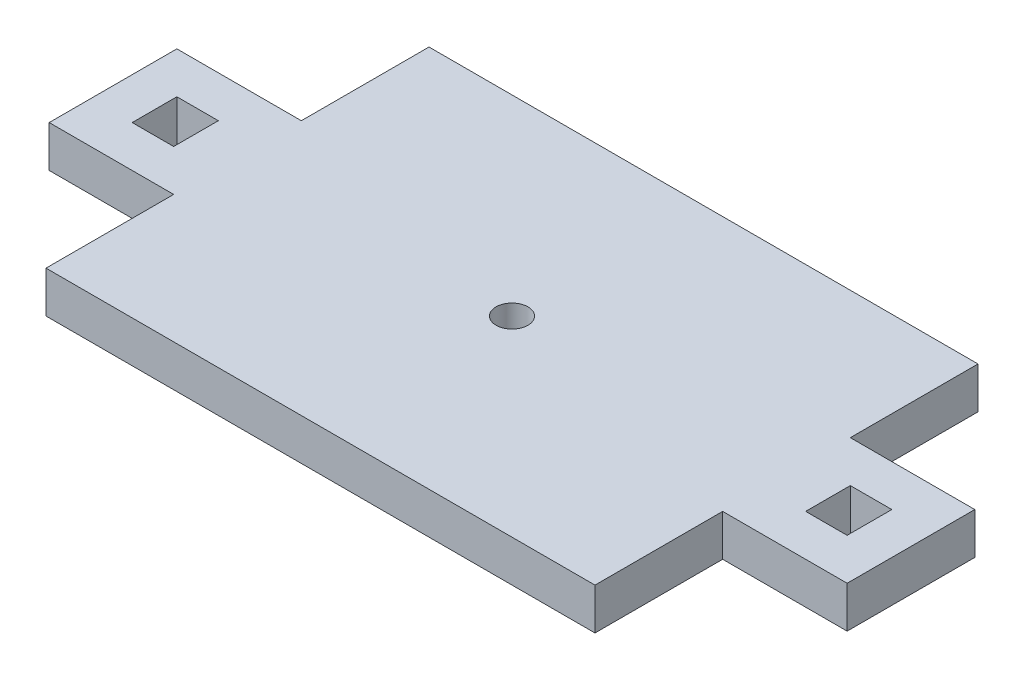
ISO-10303-21;
HEADER;
FILE_DESCRIPTION(('STEP AP214'),'2;1');
FILE_NAME('part.step','',(''),(''),'','','');
FILE_SCHEMA(('AUTOMOTIVE_DESIGN { 1 0 10303 214 1 1 1 1 }'));
ENDSEC;
DATA;
#1=APPLICATION_CONTEXT('core data for automotive mechanical design processes');
#2=APPLICATION_PROTOCOL_DEFINITION('international standard','automotive_design',2000,#1);
#3=PRODUCT_CONTEXT('',#1,'mechanical');
#4=PRODUCT('Part','Part','',(#3));
#5=PRODUCT_RELATED_PRODUCT_CATEGORY('part','',(#4));
#6=PRODUCT_DEFINITION_FORMATION('','',#4);
#7=PRODUCT_DEFINITION_CONTEXT('part definition',#1,'design');
#8=PRODUCT_DEFINITION('design','',#6,#7);
#9=PRODUCT_DEFINITION_SHAPE('','',#8);
#10=(LENGTH_UNIT() NAMED_UNIT(*) SI_UNIT(.MILLI.,.METRE.));
#11=(NAMED_UNIT(*) PLANE_ANGLE_UNIT() SI_UNIT($,.RADIAN.));
#12=(NAMED_UNIT(*) SI_UNIT($,.STERADIAN.) SOLID_ANGLE_UNIT());
#13=UNCERTAINTY_MEASURE_WITH_UNIT(LENGTH_MEASURE(1.E-05),#10,'distance_accuracy_value','');
#14=(GEOMETRIC_REPRESENTATION_CONTEXT(3) GLOBAL_UNCERTAINTY_ASSIGNED_CONTEXT((#13)) GLOBAL_UNIT_ASSIGNED_CONTEXT((#10,
#11,#12)) REPRESENTATION_CONTEXT('',''));
#15=CARTESIAN_POINT('',(0.,0.,0.));
#16=DIRECTION('',(0.,0.,1.));
#17=DIRECTION('',(1.,0.,0.));
#18=AXIS2_PLACEMENT_3D('',#15,#16,#17);
#19=CARTESIAN_POINT('',(0.,6.5,0.));
#20=DIRECTION('',(1.,0.,0.));
#21=DIRECTION('',(0.,0.,-1.));
#22=AXIS2_PLACEMENT_3D('',#19,#20,#21);
#23=PLANE('',#22);
#24=DIRECTION('',(0.,0.,1.));
#25=VECTOR('',#24,1.);
#26=CARTESIAN_POINT('',(0.,0.,0.));
#27=LINE('',#26,#25);
#28=CARTESIAN_POINT('',(0.,0.,-40.));
#29=VERTEX_POINT('',#28);
#30=CARTESIAN_POINT('',(0.,0.,-20.));
#31=VERTEX_POINT('',#30);
#32=EDGE_CURVE('E316',#29,#31,#27,.T.);
#33=ORIENTED_EDGE('',*,*,#32,.T.);
#34=DIRECTION('',(0.,1.,0.));
#35=VECTOR('',#34,1.);
#36=CARTESIAN_POINT('',(0.,-0.00100000000000013,-20.));
#37=LINE('',#36,#35);
#38=CARTESIAN_POINT('',(0.,6.5,-20.));
#39=VERTEX_POINT('',#38);
#40=EDGE_CURVE('E291',#31,#39,#37,.T.);
#41=ORIENTED_EDGE('',*,*,#40,.T.);
#42=DIRECTION('',(0.,0.,1.));
#43=VECTOR('',#42,1.);
#44=CARTESIAN_POINT('',(0.,6.5,0.));
#45=LINE('',#44,#43);
#46=CARTESIAN_POINT('',(0.,6.5,-40.));
#47=VERTEX_POINT('',#46);
#48=EDGE_CURVE('E317',#47,#39,#45,.T.);
#49=ORIENTED_EDGE('',*,*,#48,.F.);
#50=DIRECTION('',(0.,1.,0.));
#51=VECTOR('',#50,1.);
#52=CARTESIAN_POINT('',(0.,-0.00100000000000013,-40.));
#53=LINE('',#52,#51);
#54=EDGE_CURVE('E306',#29,#47,#53,.T.);
#55=ORIENTED_EDGE('',*,*,#54,.F.);
#56=EDGE_LOOP('',(#33,#41,#49,#55));
#57=FACE_BOUND('',#56,.T.);
#58=ADVANCED_FACE('F33',(#57),#23,.F.);
#59=CARTESIAN_POINT('',(0.,6.5,0.));
#60=DIRECTION('',(0.,0.,-1.));
#61=DIRECTION('',(-1.,0.,0.));
#62=AXIS2_PLACEMENT_3D('',#59,#60,#61);
#63=PLANE('',#62);
#64=DIRECTION('',(1.,0.,0.));
#65=VECTOR('',#64,1.);
#66=CARTESIAN_POINT('',(0.,0.,0.));
#67=LINE('',#66,#65);
#68=CARTESIAN_POINT('',(19.5,0.,0.));
#69=VERTEX_POINT('',#68);
#70=CARTESIAN_POINT('',(105.5,0.,0.));
#71=VERTEX_POINT('',#70);
#72=EDGE_CURVE('E326',#69,#71,#67,.T.);
#73=ORIENTED_EDGE('',*,*,#72,.T.);
#74=DIRECTION('',(0.,1.,0.));
#75=VECTOR('',#74,1.);
#76=CARTESIAN_POINT('',(105.5,-0.00100000000000013,0.));
#77=LINE('',#76,#75);
#78=CARTESIAN_POINT('',(105.5,6.5,0.));
#79=VERTEX_POINT('',#78);
#80=EDGE_CURVE('E251',#71,#79,#77,.T.);
#81=ORIENTED_EDGE('',*,*,#80,.T.);
#82=DIRECTION('',(1.,0.,0.));
#83=VECTOR('',#82,1.);
#84=CARTESIAN_POINT('',(0.,6.5,0.));
#85=LINE('',#84,#83);
#86=CARTESIAN_POINT('',(19.5,6.5,0.));
#87=VERTEX_POINT('',#86);
#88=EDGE_CURVE('E320',#87,#79,#85,.T.);
#89=ORIENTED_EDGE('',*,*,#88,.F.);
#90=DIRECTION('',(0.,1.,0.));
#91=VECTOR('',#90,1.);
#92=CARTESIAN_POINT('',(19.5,-0.00100000000000013,0.));
#93=LINE('',#92,#91);
#94=EDGE_CURVE('E290',#69,#87,#93,.T.);
#95=ORIENTED_EDGE('',*,*,#94,.F.);
#96=EDGE_LOOP('',(#73,#81,#89,#95));
#97=FACE_BOUND('',#96,.T.);
#98=ADVANCED_FACE('F373',(#97),#63,.F.);
#99=CARTESIAN_POINT('',(125.,6.5,0.));
#100=DIRECTION('',(-1.,0.,0.));
#101=DIRECTION('',(0.,0.,1.));
#102=AXIS2_PLACEMENT_3D('',#99,#100,#101);
#103=PLANE('',#102);
#104=DIRECTION('',(0.,0.,-1.));
#105=VECTOR('',#104,1.);
#106=CARTESIAN_POINT('',(125.,6.5,0.));
#107=LINE('',#106,#105);
#108=CARTESIAN_POINT('',(125.,6.5,-20.));
#109=VERTEX_POINT('',#108);
#110=CARTESIAN_POINT('',(125.,6.5,-40.));
#111=VERTEX_POINT('',#110);
#112=EDGE_CURVE('E41',#109,#111,#107,.T.);
#113=ORIENTED_EDGE('',*,*,#112,.F.);
#114=DIRECTION('',(0.,1.,0.));
#115=VECTOR('',#114,1.);
#116=CARTESIAN_POINT('',(125.,-0.00100000000000013,-20.));
#117=LINE('',#116,#115);
#118=CARTESIAN_POINT('',(125.,0.,-20.));
#119=VERTEX_POINT('',#118);
#120=EDGE_CURVE('E250',#119,#109,#117,.T.);
#121=ORIENTED_EDGE('',*,*,#120,.F.);
#122=DIRECTION('',(0.,0.,-1.));
#123=VECTOR('',#122,1.);
#124=CARTESIAN_POINT('',(125.,0.,0.));
#125=LINE('',#124,#123);
#126=CARTESIAN_POINT('',(125.,0.,-40.));
#127=VERTEX_POINT('',#126);
#128=EDGE_CURVE('E328',#119,#127,#125,.T.);
#129=ORIENTED_EDGE('',*,*,#128,.T.);
#130=DIRECTION('',(0.,1.,0.));
#131=VECTOR('',#130,1.);
#132=CARTESIAN_POINT('',(125.,-0.00100000000000013,-40.));
#133=LINE('',#132,#131);
#134=EDGE_CURVE('E273',#127,#111,#133,.T.);
#135=ORIENTED_EDGE('',*,*,#134,.T.);
#136=EDGE_LOOP('',(#113,#121,#129,#135));
#137=FACE_BOUND('',#136,.T.);
#138=ADVANCED_FACE('F363',(#137),#103,.F.);
#139=CARTESIAN_POINT('',(0.,6.5,-60.));
#140=DIRECTION('',(0.,0.,1.));
#141=DIRECTION('',(1.,0.,0.));
#142=AXIS2_PLACEMENT_3D('',#139,#140,#141);
#143=PLANE('',#142);
#144=DIRECTION('',(-1.,0.,0.));
#145=VECTOR('',#144,1.);
#146=CARTESIAN_POINT('',(0.,6.5,-60.));
#147=LINE('',#146,#145);
#148=CARTESIAN_POINT('',(105.5,6.5,-60.));
#149=VERTEX_POINT('',#148);
#150=CARTESIAN_POINT('',(19.5,6.5,-60.));
#151=VERTEX_POINT('',#150);
#152=EDGE_CURVE('E11',#149,#151,#147,.T.);
#153=ORIENTED_EDGE('',*,*,#152,.F.);
#154=DIRECTION('',(0.,1.,0.));
#155=VECTOR('',#154,1.);
#156=CARTESIAN_POINT('',(105.5,-0.00100000000000013,-60.));
#157=LINE('',#156,#155);
#158=CARTESIAN_POINT('',(105.5,0.,-60.));
#159=VERTEX_POINT('',#158);
#160=EDGE_CURVE('E272',#159,#149,#157,.T.);
#161=ORIENTED_EDGE('',*,*,#160,.F.);
#162=DIRECTION('',(-1.,0.,0.));
#163=VECTOR('',#162,1.);
#164=CARTESIAN_POINT('',(0.,0.,-60.));
#165=LINE('',#164,#163);
#166=CARTESIAN_POINT('',(19.5,0.,-60.));
#167=VERTEX_POINT('',#166);
#168=EDGE_CURVE('E36',#159,#167,#165,.T.);
#169=ORIENTED_EDGE('',*,*,#168,.T.);
#170=DIRECTION('',(0.,1.,0.));
#171=VECTOR('',#170,1.);
#172=CARTESIAN_POINT('',(19.5,-0.00100000000000013,-60.));
#173=LINE('',#172,#171);
#174=EDGE_CURVE('E307',#167,#151,#173,.T.);
#175=ORIENTED_EDGE('',*,*,#174,.T.);
#176=EDGE_LOOP('',(#153,#161,#169,#175));
#177=FACE_BOUND('',#176,.T.);
#178=ADVANCED_FACE('F338',(#177),#143,.F.);
#179=CARTESIAN_POINT('',(0.,6.5,0.));
#180=DIRECTION('',(0.,-1.,0.));
#181=DIRECTION('',(0.,0.,-1.));
#182=AXIS2_PLACEMENT_3D('',#179,#180,#181);
#183=PLANE('',#182);
#184=DIRECTION('',(-1.,0.,0.));
#185=VECTOR('',#184,1.);
#186=CARTESIAN_POINT('',(118.5,6.5,-33.5));
#187=LINE('',#186,#185);
#188=CARTESIAN_POINT('',(118.5,6.5,-33.5));
#189=VERTEX_POINT('',#188);
#190=CARTESIAN_POINT('',(112.,6.5,-33.5));
#191=VERTEX_POINT('',#190);
#192=EDGE_CURVE('E189',#189,#191,#187,.T.);
#193=ORIENTED_EDGE('',*,*,#192,.F.);
#194=DIRECTION('',(0.,0.,-1.));
#195=VECTOR('',#194,1.);
#196=CARTESIAN_POINT('',(118.5,6.5,-33.5));
#197=LINE('',#196,#195);
#198=CARTESIAN_POINT('',(118.5,6.5,-26.5));
#199=VERTEX_POINT('',#198);
#200=EDGE_CURVE('E49',#199,#189,#197,.T.);
#201=ORIENTED_EDGE('',*,*,#200,.F.);
#202=DIRECTION('',(1.,0.,0.));
#203=VECTOR('',#202,1.);
#204=CARTESIAN_POINT('',(118.5,6.5,-26.5));
#205=LINE('',#204,#203);
#206=CARTESIAN_POINT('',(112.,6.5,-26.5));
#207=VERTEX_POINT('',#206);
#208=EDGE_CURVE('E182',#207,#199,#205,.T.);
#209=ORIENTED_EDGE('',*,*,#208,.F.);
#210=DIRECTION('',(0.,0.,1.));
#211=VECTOR('',#210,1.);
#212=CARTESIAN_POINT('',(112.,6.5,-33.5));
#213=LINE('',#212,#211);
#214=EDGE_CURVE('E196',#191,#207,#213,.T.);
#215=ORIENTED_EDGE('',*,*,#214,.F.);
#216=EDGE_LOOP('',(#193,#201,#209,#215));
#217=FACE_BOUND('',#216,.T.);
#218=DIRECTION('',(1.,0.,0.));
#219=VECTOR('',#218,1.);
#220=CARTESIAN_POINT('',(6.5,6.5,-26.5));
#221=LINE('',#220,#219);
#222=CARTESIAN_POINT('',(6.5,6.5,-26.5));
#223=VERTEX_POINT('',#222);
#224=CARTESIAN_POINT('',(13.,6.5,-26.5));
#225=VERTEX_POINT('',#224);
#226=EDGE_CURVE('E215',#223,#225,#221,.T.);
#227=ORIENTED_EDGE('',*,*,#226,.F.);
#228=DIRECTION('',(0.,0.,1.));
#229=VECTOR('',#228,1.);
#230=CARTESIAN_POINT('',(6.5,6.5,-33.5));
#231=LINE('',#230,#229);
#232=CARTESIAN_POINT('',(6.5,6.5,-33.5));
#233=VERTEX_POINT('',#232);
#234=EDGE_CURVE('E213',#233,#223,#231,.T.);
#235=ORIENTED_EDGE('',*,*,#234,.F.);
#236=DIRECTION('',(-1.,0.,0.));
#237=VECTOR('',#236,1.);
#238=CARTESIAN_POINT('',(6.5,6.5,-33.5));
#239=LINE('',#238,#237);
#240=CARTESIAN_POINT('',(13.,6.5,-33.5));
#241=VERTEX_POINT('',#240);
#242=EDGE_CURVE('E221',#241,#233,#239,.T.);
#243=ORIENTED_EDGE('',*,*,#242,.F.);
#244=DIRECTION('',(0.,0.,-1.));
#245=VECTOR('',#244,1.);
#246=CARTESIAN_POINT('',(13.,6.5,-33.5));
#247=LINE('',#246,#245);
#248=EDGE_CURVE('E218',#225,#241,#247,.T.);
#249=ORIENTED_EDGE('',*,*,#248,.F.);
#250=EDGE_LOOP('',(#227,#235,#243,#249));
#251=FACE_BOUND('',#250,.T.);
#252=CARTESIAN_POINT('',(62.5,6.5,-30.));
#253=DIRECTION('',(0.,1.,0.));
#254=DIRECTION('',(0.,0.,1.));
#255=AXIS2_PLACEMENT_3D('',#252,#253,#254);
#256=CIRCLE('',#255,2.50000000000001);
#257=CARTESIAN_POINT('',(62.5,6.5,-27.5));
#258=VERTEX_POINT('',#257);
#259=EDGE_CURVE('E237',#258,#258,#256,.T.);
#260=ORIENTED_EDGE('',*,*,#259,.F.);
#261=EDGE_LOOP('',(#260));
#262=FACE_BOUND('',#261,.T.);
#263=ORIENTED_EDGE('',*,*,#88,.T.);
#264=DIRECTION('',(0.,0.,1.));
#265=VECTOR('',#264,1.);
#266=CARTESIAN_POINT('',(105.5,6.5,0.));
#267=LINE('',#266,#265);
#268=CARTESIAN_POINT('',(105.5,6.5,-20.));
#269=VERTEX_POINT('',#268);
#270=EDGE_CURVE('E248',#269,#79,#267,.T.);
#271=ORIENTED_EDGE('',*,*,#270,.F.);
#272=DIRECTION('',(-1.,0.,0.));
#273=VECTOR('',#272,1.);
#274=CARTESIAN_POINT('',(125.,6.5,-20.));
#275=LINE('',#274,#273);
#276=EDGE_CURVE('E245',#109,#269,#275,.T.);
#277=ORIENTED_EDGE('',*,*,#276,.F.);
#278=ORIENTED_EDGE('',*,*,#112,.T.);
#279=DIRECTION('',(1.,0.,0.));
#280=VECTOR('',#279,1.);
#281=CARTESIAN_POINT('',(125.,6.5,-40.));
#282=LINE('',#281,#280);
#283=CARTESIAN_POINT('',(105.5,6.5,-40.));
#284=VERTEX_POINT('',#283);
#285=EDGE_CURVE('E269',#284,#111,#282,.T.);
#286=ORIENTED_EDGE('',*,*,#285,.F.);
#287=DIRECTION('',(0.,0.,1.));
#288=VECTOR('',#287,1.);
#289=CARTESIAN_POINT('',(105.5,6.5,-60.));
#290=LINE('',#289,#288);
#291=EDGE_CURVE('E266',#149,#284,#290,.T.);
#292=ORIENTED_EDGE('',*,*,#291,.F.);
#293=ORIENTED_EDGE('',*,*,#152,.T.);
#294=DIRECTION('',(0.,0.,-1.));
#295=VECTOR('',#294,1.);
#296=CARTESIAN_POINT('',(19.5,6.5,-60.));
#297=LINE('',#296,#295);
#298=CARTESIAN_POINT('',(19.5,6.5,-40.));
#299=VERTEX_POINT('',#298);
#300=EDGE_CURVE('E303',#299,#151,#297,.T.);
#301=ORIENTED_EDGE('',*,*,#300,.F.);
#302=DIRECTION('',(1.,0.,0.));
#303=VECTOR('',#302,1.);
#304=CARTESIAN_POINT('',(0.,6.5,-40.));
#305=LINE('',#304,#303);
#306=EDGE_CURVE('E300',#47,#299,#305,.T.);
#307=ORIENTED_EDGE('',*,*,#306,.F.);
#308=ORIENTED_EDGE('',*,*,#48,.T.);
#309=DIRECTION('',(-1.,0.,0.));
#310=VECTOR('',#309,1.);
#311=CARTESIAN_POINT('',(0.,6.5,-20.));
#312=LINE('',#311,#310);
#313=CARTESIAN_POINT('',(19.5,6.5,-20.));
#314=VERTEX_POINT('',#313);
#315=EDGE_CURVE('E288',#314,#39,#312,.T.);
#316=ORIENTED_EDGE('',*,*,#315,.F.);
#317=DIRECTION('',(0.,0.,-1.));
#318=VECTOR('',#317,1.);
#319=CARTESIAN_POINT('',(19.5,6.5,0.));
#320=LINE('',#319,#318);
#321=EDGE_CURVE('E285',#87,#314,#320,.T.);
#322=ORIENTED_EDGE('',*,*,#321,.F.);
#323=EDGE_LOOP('',(#263,#271,#277,#278,#286,#292,#293,#301,#307,#308,#316,#322));
#324=FACE_BOUND('',#323,.T.);
#325=ADVANCED_FACE('F353',(#217,#251,#262,#324),#183,.F.);
#326=CARTESIAN_POINT('',(0.,0.,0.));
#327=DIRECTION('',(0.,-1.,0.));
#328=DIRECTION('',(0.,0.,-1.));
#329=AXIS2_PLACEMENT_3D('',#326,#327,#328);
#330=PLANE('',#329);
#331=DIRECTION('',(0.,0.,-1.));
#332=VECTOR('',#331,1.);
#333=CARTESIAN_POINT('',(118.5,0.,-33.5));
#334=LINE('',#333,#332);
#335=CARTESIAN_POINT('',(118.5,0.,-26.5));
#336=VERTEX_POINT('',#335);
#337=CARTESIAN_POINT('',(118.5,0.,-33.5));
#338=VERTEX_POINT('',#337);
#339=EDGE_CURVE('E180',#336,#338,#334,.T.);
#340=ORIENTED_EDGE('',*,*,#339,.T.);
#341=DIRECTION('',(-1.,0.,0.));
#342=VECTOR('',#341,1.);
#343=CARTESIAN_POINT('',(118.5,0.,-33.5));
#344=LINE('',#343,#342);
#345=CARTESIAN_POINT('',(112.,0.,-33.5));
#346=VERTEX_POINT('',#345);
#347=EDGE_CURVE('E169',#338,#346,#344,.T.);
#348=ORIENTED_EDGE('',*,*,#347,.T.);
#349=DIRECTION('',(0.,0.,1.));
#350=VECTOR('',#349,1.);
#351=CARTESIAN_POINT('',(112.,0.,-33.5));
#352=LINE('',#351,#350);
#353=CARTESIAN_POINT('',(112.,0.,-26.5));
#354=VERTEX_POINT('',#353);
#355=EDGE_CURVE('E191',#346,#354,#352,.T.);
#356=ORIENTED_EDGE('',*,*,#355,.T.);
#357=DIRECTION('',(1.,0.,0.));
#358=VECTOR('',#357,1.);
#359=CARTESIAN_POINT('',(118.5,0.,-26.5));
#360=LINE('',#359,#358);
#361=EDGE_CURVE('E187',#354,#336,#360,.T.);
#362=ORIENTED_EDGE('',*,*,#361,.T.);
#363=EDGE_LOOP('',(#340,#348,#356,#362));
#364=FACE_BOUND('',#363,.T.);
#365=DIRECTION('',(0.,0.,1.));
#366=VECTOR('',#365,1.);
#367=CARTESIAN_POINT('',(6.5,0.,-33.5));
#368=LINE('',#367,#366);
#369=CARTESIAN_POINT('',(6.5,0.,-33.5));
#370=VERTEX_POINT('',#369);
#371=CARTESIAN_POINT('',(6.5,0.,-26.5));
#372=VERTEX_POINT('',#371);
#373=EDGE_CURVE('E210',#370,#372,#368,.T.);
#374=ORIENTED_EDGE('',*,*,#373,.T.);
#375=DIRECTION('',(1.,0.,0.));
#376=VECTOR('',#375,1.);
#377=CARTESIAN_POINT('',(6.5,0.,-26.5));
#378=LINE('',#377,#376);
#379=CARTESIAN_POINT('',(13.,0.,-26.5));
#380=VERTEX_POINT('',#379);
#381=EDGE_CURVE('E227',#372,#380,#378,.T.);
#382=ORIENTED_EDGE('',*,*,#381,.T.);
#383=DIRECTION('',(0.,0.,-1.));
#384=VECTOR('',#383,1.);
#385=CARTESIAN_POINT('',(13.,0.,-33.5));
#386=LINE('',#385,#384);
#387=CARTESIAN_POINT('',(13.,0.,-33.5));
#388=VERTEX_POINT('',#387);
#389=EDGE_CURVE('E176',#380,#388,#386,.T.);
#390=ORIENTED_EDGE('',*,*,#389,.T.);
#391=DIRECTION('',(-1.,0.,0.));
#392=VECTOR('',#391,1.);
#393=CARTESIAN_POINT('',(6.5,0.,-33.5));
#394=LINE('',#393,#392);
#395=EDGE_CURVE('E207',#388,#370,#394,.T.);
#396=ORIENTED_EDGE('',*,*,#395,.T.);
#397=EDGE_LOOP('',(#374,#382,#390,#396));
#398=FACE_BOUND('',#397,.T.);
#399=CARTESIAN_POINT('',(62.5,0.,-30.));
#400=DIRECTION('',(0.,-1.,0.));
#401=DIRECTION('',(0.,0.,-1.));
#402=AXIS2_PLACEMENT_3D('',#399,#400,#401);
#403=CIRCLE('',#402,2.50000000000001);
#404=CARTESIAN_POINT('',(62.5,0.,-27.5));
#405=VERTEX_POINT('',#404);
#406=EDGE_CURVE('E236',#405,#405,#403,.F.);
#407=ORIENTED_EDGE('',*,*,#406,.T.);
#408=EDGE_LOOP('',(#407));
#409=FACE_BOUND('',#408,.T.);
#410=DIRECTION('',(0.,0.,1.));
#411=VECTOR('',#410,1.);
#412=CARTESIAN_POINT('',(105.5,0.,0.));
#413=LINE('',#412,#411);
#414=CARTESIAN_POINT('',(105.5,0.,-20.));
#415=VERTEX_POINT('',#414);
#416=EDGE_CURVE('E240',#415,#71,#413,.T.);
#417=ORIENTED_EDGE('',*,*,#416,.T.);
#418=ORIENTED_EDGE('',*,*,#72,.F.);
#419=DIRECTION('',(0.,0.,-1.));
#420=VECTOR('',#419,1.);
#421=CARTESIAN_POINT('',(19.5,0.,0.));
#422=LINE('',#421,#420);
#423=CARTESIAN_POINT('',(19.5,0.,-20.));
#424=VERTEX_POINT('',#423);
#425=EDGE_CURVE('E276',#69,#424,#422,.T.);
#426=ORIENTED_EDGE('',*,*,#425,.T.);
#427=DIRECTION('',(-1.,0.,0.));
#428=VECTOR('',#427,1.);
#429=CARTESIAN_POINT('',(0.,0.,-20.));
#430=LINE('',#429,#428);
#431=EDGE_CURVE('E282',#424,#31,#430,.T.);
#432=ORIENTED_EDGE('',*,*,#431,.T.);
#433=ORIENTED_EDGE('',*,*,#32,.F.);
#434=DIRECTION('',(1.,0.,0.));
#435=VECTOR('',#434,1.);
#436=CARTESIAN_POINT('',(0.,0.,-40.));
#437=LINE('',#436,#435);
#438=CARTESIAN_POINT('',(19.5,0.,-40.));
#439=VERTEX_POINT('',#438);
#440=EDGE_CURVE('E310',#29,#439,#437,.T.);
#441=ORIENTED_EDGE('',*,*,#440,.T.);
#442=DIRECTION('',(0.,0.,-1.));
#443=VECTOR('',#442,1.);
#444=CARTESIAN_POINT('',(19.5,0.,-60.));
#445=LINE('',#444,#443);
#446=EDGE_CURVE('E294',#439,#167,#445,.T.);
#447=ORIENTED_EDGE('',*,*,#446,.T.);
#448=ORIENTED_EDGE('',*,*,#168,.F.);
#449=DIRECTION('',(0.,0.,1.));
#450=VECTOR('',#449,1.);
#451=CARTESIAN_POINT('',(105.5,0.,-60.));
#452=LINE('',#451,#450);
#453=CARTESIAN_POINT('',(105.5,0.,-40.));
#454=VERTEX_POINT('',#453);
#455=EDGE_CURVE('E260',#159,#454,#452,.T.);
#456=ORIENTED_EDGE('',*,*,#455,.T.);
#457=DIRECTION('',(1.,0.,0.));
#458=VECTOR('',#457,1.);
#459=CARTESIAN_POINT('',(125.,0.,-40.));
#460=LINE('',#459,#458);
#461=EDGE_CURVE('E263',#454,#127,#460,.T.);
#462=ORIENTED_EDGE('',*,*,#461,.T.);
#463=ORIENTED_EDGE('',*,*,#128,.F.);
#464=DIRECTION('',(-1.,0.,0.));
#465=VECTOR('',#464,1.);
#466=CARTESIAN_POINT('',(125.,0.,-20.));
#467=LINE('',#466,#465);
#468=EDGE_CURVE('E254',#119,#415,#467,.T.);
#469=ORIENTED_EDGE('',*,*,#468,.T.);
#470=EDGE_LOOP('',(#417,#418,#426,#432,#433,#441,#447,#448,#456,#462,#463,#469));
#471=FACE_BOUND('',#470,.T.);
#472=ADVANCED_FACE('F185',(#364,#398,#409,#471),#330,.T.);
#473=CARTESIAN_POINT('',(19.5,-0.00100000000000013,-60.));
#474=DIRECTION('',(1.,0.,0.));
#475=DIRECTION('',(0.,0.,-1.));
#476=AXIS2_PLACEMENT_3D('',#473,#474,#475);
#477=PLANE('',#476);
#478=DIRECTION('',(0.,1.,0.));
#479=VECTOR('',#478,1.);
#480=CARTESIAN_POINT('',(19.5,-0.00100000000000013,-40.));
#481=LINE('',#480,#479);
#482=EDGE_CURVE('E311',#439,#299,#481,.T.);
#483=ORIENTED_EDGE('',*,*,#482,.T.);
#484=ORIENTED_EDGE('',*,*,#300,.T.);
#485=ORIENTED_EDGE('',*,*,#174,.F.);
#486=ORIENTED_EDGE('',*,*,#446,.F.);
#487=EDGE_LOOP('',(#483,#484,#485,#486));
#488=FACE_BOUND('',#487,.T.);
#489=ADVANCED_FACE('F342',(#488),#477,.F.);
#490=CARTESIAN_POINT('',(0.,-0.00100000000000013,-40.));
#491=DIRECTION('',(0.,0.,1.));
#492=DIRECTION('',(1.,0.,0.));
#493=AXIS2_PLACEMENT_3D('',#490,#491,#492);
#494=PLANE('',#493);
#495=ORIENTED_EDGE('',*,*,#54,.T.);
#496=ORIENTED_EDGE('',*,*,#306,.T.);
#497=ORIENTED_EDGE('',*,*,#482,.F.);
#498=ORIENTED_EDGE('',*,*,#440,.F.);
#499=EDGE_LOOP('',(#495,#496,#497,#498));
#500=FACE_BOUND('',#499,.T.);
#501=ADVANCED_FACE('F347',(#500),#494,.F.);
#502=CARTESIAN_POINT('',(0.,-0.00100000000000013,-20.));
#503=DIRECTION('',(0.,0.,-1.));
#504=DIRECTION('',(-1.,0.,0.));
#505=AXIS2_PLACEMENT_3D('',#502,#503,#504);
#506=PLANE('',#505);
#507=DIRECTION('',(0.,1.,0.));
#508=VECTOR('',#507,1.);
#509=CARTESIAN_POINT('',(19.5,-0.00100000000000013,-20.));
#510=LINE('',#509,#508);
#511=EDGE_CURVE('E295',#424,#314,#510,.T.);
#512=ORIENTED_EDGE('',*,*,#511,.T.);
#513=ORIENTED_EDGE('',*,*,#315,.T.);
#514=ORIENTED_EDGE('',*,*,#40,.F.);
#515=ORIENTED_EDGE('',*,*,#431,.F.);
#516=EDGE_LOOP('',(#512,#513,#514,#515));
#517=FACE_BOUND('',#516,.T.);
#518=ADVANCED_FACE('F379',(#517),#506,.F.);
#519=CARTESIAN_POINT('',(19.5,-0.00100000000000013,0.));
#520=DIRECTION('',(1.,0.,0.));
#521=DIRECTION('',(0.,0.,-1.));
#522=AXIS2_PLACEMENT_3D('',#519,#520,#521);
#523=PLANE('',#522);
#524=ORIENTED_EDGE('',*,*,#94,.T.);
#525=ORIENTED_EDGE('',*,*,#321,.T.);
#526=ORIENTED_EDGE('',*,*,#511,.F.);
#527=ORIENTED_EDGE('',*,*,#425,.F.);
#528=EDGE_LOOP('',(#524,#525,#526,#527));
#529=FACE_BOUND('',#528,.T.);
#530=ADVANCED_FACE('F376',(#529),#523,.F.);
#531=CARTESIAN_POINT('',(125.,-0.00100000000000013,-40.));
#532=DIRECTION('',(0.,0.,1.));
#533=DIRECTION('',(1.,0.,0.));
#534=AXIS2_PLACEMENT_3D('',#531,#532,#533);
#535=PLANE('',#534);
#536=DIRECTION('',(0.,1.,0.));
#537=VECTOR('',#536,1.);
#538=CARTESIAN_POINT('',(105.5,-0.00100000000000013,-40.));
#539=LINE('',#538,#537);
#540=EDGE_CURVE('E277',#454,#284,#539,.T.);
#541=ORIENTED_EDGE('',*,*,#540,.T.);
#542=ORIENTED_EDGE('',*,*,#285,.T.);
#543=ORIENTED_EDGE('',*,*,#134,.F.);
#544=ORIENTED_EDGE('',*,*,#461,.F.);
#545=EDGE_LOOP('',(#541,#542,#543,#544));
#546=FACE_BOUND('',#545,.T.);
#547=ADVANCED_FACE('F361',(#546),#535,.F.);
#548=CARTESIAN_POINT('',(105.5,-0.00100000000000013,-60.));
#549=DIRECTION('',(-1.,0.,0.));
#550=DIRECTION('',(0.,0.,1.));
#551=AXIS2_PLACEMENT_3D('',#548,#549,#550);
#552=PLANE('',#551);
#553=ORIENTED_EDGE('',*,*,#160,.T.);
#554=ORIENTED_EDGE('',*,*,#291,.T.);
#555=ORIENTED_EDGE('',*,*,#540,.F.);
#556=ORIENTED_EDGE('',*,*,#455,.F.);
#557=EDGE_LOOP('',(#553,#554,#555,#556));
#558=FACE_BOUND('',#557,.T.);
#559=ADVANCED_FACE('F358',(#558),#552,.F.);
#560=CARTESIAN_POINT('',(105.5,-0.00100000000000013,0.));
#561=DIRECTION('',(-1.,0.,0.));
#562=DIRECTION('',(0.,0.,1.));
#563=AXIS2_PLACEMENT_3D('',#560,#561,#562);
#564=PLANE('',#563);
#565=DIRECTION('',(0.,1.,0.));
#566=VECTOR('',#565,1.);
#567=CARTESIAN_POINT('',(105.5,-0.00100000000000013,-20.));
#568=LINE('',#567,#566);
#569=EDGE_CURVE('E255',#415,#269,#568,.T.);
#570=ORIENTED_EDGE('',*,*,#569,.T.);
#571=ORIENTED_EDGE('',*,*,#270,.T.);
#572=ORIENTED_EDGE('',*,*,#80,.F.);
#573=ORIENTED_EDGE('',*,*,#416,.F.);
#574=EDGE_LOOP('',(#570,#571,#572,#573));
#575=FACE_BOUND('',#574,.T.);
#576=ADVANCED_FACE('F444',(#575),#564,.F.);
#577=CARTESIAN_POINT('',(125.,-0.00100000000000013,-20.));
#578=DIRECTION('',(0.,0.,-1.));
#579=DIRECTION('',(-1.,0.,0.));
#580=AXIS2_PLACEMENT_3D('',#577,#578,#579);
#581=PLANE('',#580);
#582=ORIENTED_EDGE('',*,*,#120,.T.);
#583=ORIENTED_EDGE('',*,*,#276,.T.);
#584=ORIENTED_EDGE('',*,*,#569,.F.);
#585=ORIENTED_EDGE('',*,*,#468,.F.);
#586=EDGE_LOOP('',(#582,#583,#584,#585));
#587=FACE_BOUND('',#586,.T.);
#588=ADVANCED_FACE('F367',(#587),#581,.F.);
#589=CARTESIAN_POINT('',(62.5,-0.00100000000000013,-30.));
#590=DIRECTION('',(0.,1.,0.));
#591=DIRECTION('',(0.,0.,1.));
#592=AXIS2_PLACEMENT_3D('',#589,#590,#591);
#593=CYLINDRICAL_SURFACE('',#592,2.50000000000001);
#594=CARTESIAN_POINT('',(62.5,0.,-27.5));
#595=CARTESIAN_POINT('',(62.5,0.0677083333333333,-27.5));
#596=CARTESIAN_POINT('',(62.5,0.135416666666667,-27.5));
#597=CARTESIAN_POINT('',(62.5,0.270833333333333,-27.5));
#598=CARTESIAN_POINT('',(62.5,0.338541666666667,-27.5));
#599=CARTESIAN_POINT('',(62.5,0.473958333333333,-27.5));
#600=CARTESIAN_POINT('',(62.5,0.541666666666667,-27.5));
#601=CARTESIAN_POINT('',(62.5,0.677083333333333,-27.5));
#602=CARTESIAN_POINT('',(62.5,0.744791666666667,-27.5));
#603=CARTESIAN_POINT('',(62.5,0.880208333333333,-27.5));
#604=CARTESIAN_POINT('',(62.5,0.947916666666666,-27.5));
#605=CARTESIAN_POINT('',(62.5,1.08333333333333,-27.5));
#606=CARTESIAN_POINT('',(62.5,1.15104166666667,-27.5));
#607=CARTESIAN_POINT('',(62.5,1.28645833333333,-27.5));
#608=CARTESIAN_POINT('',(62.5,1.35416666666667,-27.5));
#609=CARTESIAN_POINT('',(62.5,1.48958333333333,-27.5));
#610=CARTESIAN_POINT('',(62.5,1.55729166666667,-27.5));
#611=CARTESIAN_POINT('',(62.5,1.69270833333333,-27.5));
#612=CARTESIAN_POINT('',(62.5,1.76041666666667,-27.5));
#613=CARTESIAN_POINT('',(62.5,1.89583333333333,-27.5));
#614=CARTESIAN_POINT('',(62.5,1.96354166666667,-27.5));
#615=CARTESIAN_POINT('',(62.5,2.09895833333333,-27.5));
#616=CARTESIAN_POINT('',(62.5,2.16666666666667,-27.5));
#617=CARTESIAN_POINT('',(62.5,2.30208333333333,-27.5));
#618=CARTESIAN_POINT('',(62.5,2.36979166666667,-27.5));
#619=CARTESIAN_POINT('',(62.5,2.50520833333333,-27.5));
#620=CARTESIAN_POINT('',(62.5,2.57291666666667,-27.5));
#621=CARTESIAN_POINT('',(62.5,2.70833333333333,-27.5));
#622=CARTESIAN_POINT('',(62.5,2.77604166666667,-27.5));
#623=CARTESIAN_POINT('',(62.5,2.91145833333333,-27.5));
#624=CARTESIAN_POINT('',(62.5,2.97916666666667,-27.5));
#625=CARTESIAN_POINT('',(62.5,3.11458333333333,-27.5));
#626=CARTESIAN_POINT('',(62.5,3.18229166666667,-27.5));
#627=CARTESIAN_POINT('',(62.5,3.31770833333333,-27.5));
#628=CARTESIAN_POINT('',(62.5,3.38541666666667,-27.5));
#629=CARTESIAN_POINT('',(62.5,3.52083333333333,-27.5));
#630=CARTESIAN_POINT('',(62.5,3.58854166666667,-27.5));
#631=CARTESIAN_POINT('',(62.5,3.72395833333333,-27.5));
#632=CARTESIAN_POINT('',(62.5,3.79166666666667,-27.5));
#633=CARTESIAN_POINT('',(62.5,3.92708333333333,-27.5));
#634=CARTESIAN_POINT('',(62.5,3.99479166666667,-27.5));
#635=CARTESIAN_POINT('',(62.5,4.13020833333333,-27.5));
#636=CARTESIAN_POINT('',(62.5,4.19791666666667,-27.5));
#637=CARTESIAN_POINT('',(62.5,4.33333333333333,-27.5));
#638=CARTESIAN_POINT('',(62.5,4.40104166666667,-27.5));
#639=CARTESIAN_POINT('',(62.5,4.53645833333333,-27.5));
#640=CARTESIAN_POINT('',(62.5,4.60416666666667,-27.5));
#641=CARTESIAN_POINT('',(62.5,4.73958333333333,-27.5));
#642=CARTESIAN_POINT('',(62.5,4.80729166666667,-27.5));
#643=CARTESIAN_POINT('',(62.5,4.94270833333333,-27.5));
#644=CARTESIAN_POINT('',(62.5,5.01041666666667,-27.5));
#645=CARTESIAN_POINT('',(62.5,5.14583333333333,-27.5));
#646=CARTESIAN_POINT('',(62.5,5.21354166666667,-27.5));
#647=CARTESIAN_POINT('',(62.5,5.34895833333333,-27.5));
#648=CARTESIAN_POINT('',(62.5,5.41666666666667,-27.5));
#649=CARTESIAN_POINT('',(62.5,5.55208333333333,-27.5));
#650=CARTESIAN_POINT('',(62.5,5.61979166666667,-27.5));
#651=CARTESIAN_POINT('',(62.5,5.75520833333333,-27.5));
#652=CARTESIAN_POINT('',(62.5,5.82291666666667,-27.5));
#653=CARTESIAN_POINT('',(62.5,5.95833333333333,-27.5));
#654=CARTESIAN_POINT('',(62.5,6.02604166666667,-27.5));
#655=CARTESIAN_POINT('',(62.5,6.16145833333333,-27.5));
#656=CARTESIAN_POINT('',(62.5,6.22916666666667,-27.5));
#657=CARTESIAN_POINT('',(62.5,6.36458333333333,-27.5));
#658=CARTESIAN_POINT('',(62.5,6.43229166666667,-27.5));
#659=CARTESIAN_POINT('',(62.5,6.5,-27.5));
#660=B_SPLINE_CURVE_WITH_KNOTS('',3,(#594,#595,#596,#597,#598,#599,#600,#601,#602,#603,#604,
#605,#606,#607,#608,#609,#610,#611,#612,#613,#614,#615,#616,#617,#618,#619,#620,#621,#622,#623,
#624,#625,#626,#627,#628,#629,#630,#631,#632,#633,#634,#635,#636,#637,#638,#639,#640,#641,#642,
#643,#644,#645,#646,#647,#648,#649,#650,#651,#652,#653,#654,#655,#656,#657,#658,#659),
.UNSPECIFIED.,.F.,.F.,(4,2,2,2,2,2,2,2,2,2,2,2,2,2,2,2,2,2,2,2,2,2,2,2,2,2,2,2,2,2,2,2,4),(0.,
0.203125,0.40625,0.609375,0.8125,1.015625,1.21875,1.421875,1.625,1.828125,2.03125,2.234375,
2.4375,2.640625,2.84375,3.046875,3.25,3.453125,3.65625,3.859375,4.0625,4.265625,4.46875,
4.671875,4.875,5.078125,5.28125,5.484375,5.6875,5.890625,6.09375,6.296875,6.5),.UNSPECIFIED.);
#661=EDGE_CURVE('BSEAM460',#405,#258,#660,.T.);
#662=ORIENTED_EDGE('',*,*,#406,.F.);
#663=ORIENTED_EDGE('',*,*,#259,.T.);
#664=ORIENTED_EDGE('',*,*,#661,.T.);
#665=ORIENTED_EDGE('',*,*,#661,.F.);
#666=EDGE_LOOP('',(#662,#664,#663,#665));
#667=FACE_BOUND('',#666,.T.);
#668=ADVANCED_FACE('F460',(#667),#593,.F.);
#669=CARTESIAN_POINT('',(6.5,-0.00100000000000013,-33.5));
#670=DIRECTION('',(-1.,0.,0.));
#671=DIRECTION('',(0.,0.,1.));
#672=AXIS2_PLACEMENT_3D('',#669,#670,#671);
#673=PLANE('',#672);
#674=DIRECTION('',(0.,1.,0.));
#675=VECTOR('',#674,1.);
#676=CARTESIAN_POINT('',(6.5,-0.00100000000000013,-33.5));
#677=LINE('',#676,#675);
#678=EDGE_CURVE('E225',#370,#233,#677,.T.);
#679=ORIENTED_EDGE('',*,*,#678,.T.);
#680=ORIENTED_EDGE('',*,*,#234,.T.);
#681=DIRECTION('',(0.,1.,0.));
#682=VECTOR('',#681,1.);
#683=CARTESIAN_POINT('',(6.5,-0.00100000000000013,-26.5));
#684=LINE('',#683,#682);
#685=EDGE_CURVE('E224',#372,#223,#684,.T.);
#686=ORIENTED_EDGE('',*,*,#685,.F.);
#687=ORIENTED_EDGE('',*,*,#373,.F.);
#688=EDGE_LOOP('',(#679,#680,#686,#687));
#689=FACE_BOUND('',#688,.T.);
#690=ADVANCED_FACE('F468',(#689),#673,.F.);
#691=CARTESIAN_POINT('',(6.5,-0.00100000000000013,-33.5));
#692=DIRECTION('',(0.,0.,-1.));
#693=DIRECTION('',(-1.,0.,0.));
#694=AXIS2_PLACEMENT_3D('',#691,#692,#693);
#695=PLANE('',#694);
#696=DIRECTION('',(0.,1.,0.));
#697=VECTOR('',#696,1.);
#698=CARTESIAN_POINT('',(13.,-0.00100000000000013,-33.5));
#699=LINE('',#698,#697);
#700=EDGE_CURVE('E228',#388,#241,#699,.T.);
#701=ORIENTED_EDGE('',*,*,#700,.T.);
#702=ORIENTED_EDGE('',*,*,#242,.T.);
#703=ORIENTED_EDGE('',*,*,#678,.F.);
#704=ORIENTED_EDGE('',*,*,#395,.F.);
#705=EDGE_LOOP('',(#701,#702,#703,#704));
#706=FACE_BOUND('',#705,.T.);
#707=ADVANCED_FACE('F483',(#706),#695,.F.);
#708=CARTESIAN_POINT('',(13.,-0.00100000000000013,-33.5));
#709=DIRECTION('',(1.,0.,0.));
#710=DIRECTION('',(0.,0.,-1.));
#711=AXIS2_PLACEMENT_3D('',#708,#709,#710);
#712=PLANE('',#711);
#713=DIRECTION('',(0.,1.,0.));
#714=VECTOR('',#713,1.);
#715=CARTESIAN_POINT('',(13.,-0.00100000000000013,-26.5));
#716=LINE('',#715,#714);
#717=EDGE_CURVE('E230',#380,#225,#716,.T.);
#718=ORIENTED_EDGE('',*,*,#717,.T.);
#719=ORIENTED_EDGE('',*,*,#248,.T.);
#720=ORIENTED_EDGE('',*,*,#700,.F.);
#721=ORIENTED_EDGE('',*,*,#389,.F.);
#722=EDGE_LOOP('',(#718,#719,#720,#721));
#723=FACE_BOUND('',#722,.T.);
#724=ADVANCED_FACE('F493',(#723),#712,.F.);
#725=CARTESIAN_POINT('',(6.5,-0.00100000000000013,-26.5));
#726=DIRECTION('',(0.,0.,1.));
#727=DIRECTION('',(1.,0.,0.));
#728=AXIS2_PLACEMENT_3D('',#725,#726,#727);
#729=PLANE('',#728);
#730=ORIENTED_EDGE('',*,*,#685,.T.);
#731=ORIENTED_EDGE('',*,*,#226,.T.);
#732=ORIENTED_EDGE('',*,*,#717,.F.);
#733=ORIENTED_EDGE('',*,*,#381,.F.);
#734=EDGE_LOOP('',(#730,#731,#732,#733));
#735=FACE_BOUND('',#734,.T.);
#736=ADVANCED_FACE('F503',(#735),#729,.F.);
#737=CARTESIAN_POINT('',(118.5,-0.00100000000000013,-33.5));
#738=DIRECTION('',(1.,0.,0.));
#739=DIRECTION('',(0.,0.,-1.));
#740=AXIS2_PLACEMENT_3D('',#737,#738,#739);
#741=PLANE('',#740);
#742=DIRECTION('',(0.,1.,0.));
#743=VECTOR('',#742,1.);
#744=CARTESIAN_POINT('',(118.5,-0.00100000000000013,-26.5));
#745=LINE('',#744,#743);
#746=EDGE_CURVE('E177',#336,#199,#745,.T.);
#747=ORIENTED_EDGE('',*,*,#746,.T.);
#748=ORIENTED_EDGE('',*,*,#200,.T.);
#749=DIRECTION('',(0.,1.,0.));
#750=VECTOR('',#749,1.);
#751=CARTESIAN_POINT('',(118.5,-0.00100000000000013,-33.5));
#752=LINE('',#751,#750);
#753=EDGE_CURVE('E171',#338,#189,#752,.T.);
#754=ORIENTED_EDGE('',*,*,#753,.F.);
#755=ORIENTED_EDGE('',*,*,#339,.F.);
#756=EDGE_LOOP('',(#747,#748,#754,#755));
#757=FACE_BOUND('',#756,.T.);
#758=ADVANCED_FACE('F179',(#757),#741,.F.);
#759=CARTESIAN_POINT('',(118.5,-0.00100000000000013,-26.5));
#760=DIRECTION('',(0.,0.,1.));
#761=DIRECTION('',(1.,0.,0.));
#762=AXIS2_PLACEMENT_3D('',#759,#760,#761);
#763=PLANE('',#762);
#764=DIRECTION('',(0.,1.,0.));
#765=VECTOR('',#764,1.);
#766=CARTESIAN_POINT('',(112.,-0.00100000000000013,-26.5));
#767=LINE('',#766,#765);
#768=EDGE_CURVE('E202',#354,#207,#767,.T.);
#769=ORIENTED_EDGE('',*,*,#768,.T.);
#770=ORIENTED_EDGE('',*,*,#208,.T.);
#771=ORIENTED_EDGE('',*,*,#746,.F.);
#772=ORIENTED_EDGE('',*,*,#361,.F.);
#773=EDGE_LOOP('',(#769,#770,#771,#772));
#774=FACE_BOUND('',#773,.T.);
#775=ADVANCED_FACE('F522',(#774),#763,.F.);
#776=CARTESIAN_POINT('',(112.,-0.00100000000000013,-33.5));
#777=DIRECTION('',(-1.,0.,0.));
#778=DIRECTION('',(0.,0.,1.));
#779=AXIS2_PLACEMENT_3D('',#776,#777,#778);
#780=PLANE('',#779);
#781=DIRECTION('',(0.,1.,0.));
#782=VECTOR('',#781,1.);
#783=CARTESIAN_POINT('',(112.,-0.00100000000000013,-33.5));
#784=LINE('',#783,#782);
#785=EDGE_CURVE('E57',#346,#191,#784,.T.);
#786=ORIENTED_EDGE('',*,*,#785,.T.);
#787=ORIENTED_EDGE('',*,*,#214,.T.);
#788=ORIENTED_EDGE('',*,*,#768,.F.);
#789=ORIENTED_EDGE('',*,*,#355,.F.);
#790=EDGE_LOOP('',(#786,#787,#788,#789));
#791=FACE_BOUND('',#790,.T.);
#792=ADVANCED_FACE('F531',(#791),#780,.F.);
#793=CARTESIAN_POINT('',(118.5,-0.00100000000000013,-33.5));
#794=DIRECTION('',(0.,0.,-1.));
#795=DIRECTION('',(-1.,0.,0.));
#796=AXIS2_PLACEMENT_3D('',#793,#794,#795);
#797=PLANE('',#796);
#798=ORIENTED_EDGE('',*,*,#753,.T.);
#799=ORIENTED_EDGE('',*,*,#192,.T.);
#800=ORIENTED_EDGE('',*,*,#785,.F.);
#801=ORIENTED_EDGE('',*,*,#347,.F.);
#802=EDGE_LOOP('',(#798,#799,#800,#801));
#803=FACE_BOUND('',#802,.T.);
#804=ADVANCED_FACE('F170',(#803),#797,.F.);
#805=CLOSED_SHELL('',(#58,#98,#138,#178,#325,#472,#489,#501,#518,#530,#547,#559,#576,#588,#668,
#690,#707,#724,#736,#758,#775,#792,#804));
#806=MANIFOLD_SOLID_BREP('B2',#805);
#807=ADVANCED_BREP_SHAPE_REPRESENTATION('',(#18,#806),#14);
#808=SHAPE_DEFINITION_REPRESENTATION(#9,#807);
ENDSEC;
END-ISO-10303-21;
